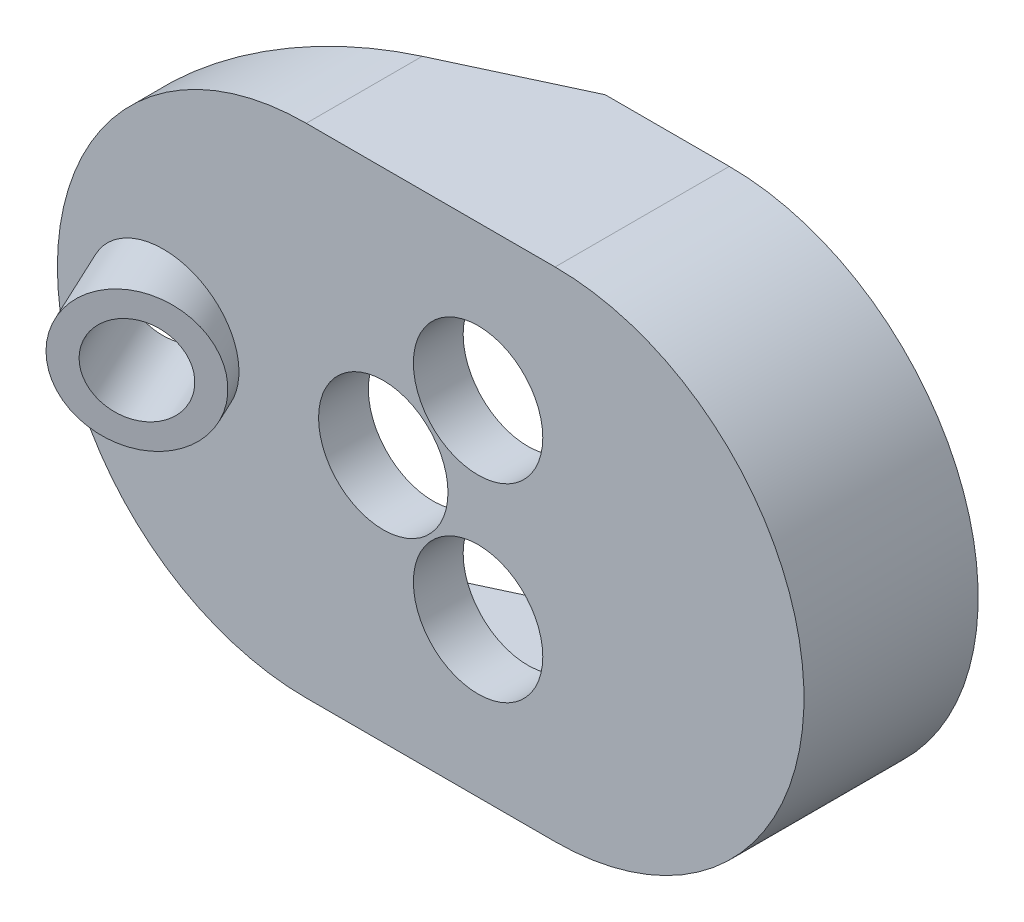
ISO-10303-21;
HEADER;
FILE_DESCRIPTION(('STEP AP214'),'2;1');
FILE_NAME('part.step','',(''),(''),'','','');
FILE_SCHEMA(('AUTOMOTIVE_DESIGN { 1 0 10303 214 1 1 1 1 }'));
ENDSEC;
DATA;
#1=APPLICATION_CONTEXT('core data for automotive mechanical design processes');
#2=APPLICATION_PROTOCOL_DEFINITION('international standard','automotive_design',2000,#1);
#3=PRODUCT_CONTEXT('',#1,'mechanical');
#4=PRODUCT('Part','Part','',(#3));
#5=PRODUCT_RELATED_PRODUCT_CATEGORY('part','',(#4));
#6=PRODUCT_DEFINITION_FORMATION('','',#4);
#7=PRODUCT_DEFINITION_CONTEXT('part definition',#1,'design');
#8=PRODUCT_DEFINITION('design','',#6,#7);
#9=PRODUCT_DEFINITION_SHAPE('','',#8);
#10=(LENGTH_UNIT() NAMED_UNIT(*) SI_UNIT(.MILLI.,.METRE.));
#11=(NAMED_UNIT(*) PLANE_ANGLE_UNIT() SI_UNIT($,.RADIAN.));
#12=(NAMED_UNIT(*) SI_UNIT($,.STERADIAN.) SOLID_ANGLE_UNIT());
#13=UNCERTAINTY_MEASURE_WITH_UNIT(LENGTH_MEASURE(1.E-05),#10,'distance_accuracy_value','');
#14=(GEOMETRIC_REPRESENTATION_CONTEXT(3) GLOBAL_UNCERTAINTY_ASSIGNED_CONTEXT((#13)) GLOBAL_UNIT_ASSIGNED_CONTEXT((#10,
#11,#12)) REPRESENTATION_CONTEXT('',''));
#15=CARTESIAN_POINT('',(0.,0.,0.));
#16=DIRECTION('',(0.,0.,1.));
#17=DIRECTION('',(1.,0.,0.));
#18=AXIS2_PLACEMENT_3D('',#15,#16,#17);
#19=CARTESIAN_POINT('',(-5.,0.,0.));
#20=DIRECTION('',(0.,0.,1.));
#21=DIRECTION('',(1.,0.,0.));
#22=AXIS2_PLACEMENT_3D('',#19,#20,#21);
#23=PLANE('',#22);
#24=CARTESIAN_POINT('',(11.5,2.5,0.));
#25=DIRECTION('',(0.,0.,-1.));
#26=DIRECTION('',(-1.,0.,0.));
#27=AXIS2_PLACEMENT_3D('',#24,#25,#26);
#28=CIRCLE('',#27,2.);
#29=CARTESIAN_POINT('',(9.5,2.5,0.));
#30=VERTEX_POINT('',#29);
#31=EDGE_CURVE('E258',#30,#30,#28,.T.);
#32=ORIENTED_EDGE('',*,*,#31,.F.);
#33=EDGE_LOOP('',(#32));
#34=FACE_BOUND('',#33,.T.);
#35=CARTESIAN_POINT('',(11.5,-2.5,0.));
#36=DIRECTION('',(0.,0.,-1.));
#37=DIRECTION('',(-1.,0.,0.));
#38=AXIS2_PLACEMENT_3D('',#35,#36,#37);
#39=CIRCLE('',#38,2.);
#40=CARTESIAN_POINT('',(9.5,-2.5,0.));
#41=VERTEX_POINT('',#40);
#42=EDGE_CURVE('E268',#41,#41,#39,.T.);
#43=ORIENTED_EDGE('',*,*,#42,.F.);
#44=EDGE_LOOP('',(#43));
#45=FACE_BOUND('',#44,.T.);
#46=DIRECTION('',(0.,-1.,0.));
#47=VECTOR('',#46,1.);
#48=CARTESIAN_POINT('',(0.0115484435668667,10.,0.));
#49=LINE('',#48,#47);
#50=CARTESIAN_POINT('',(0.0115484435668667,10.,0.));
#51=VERTEX_POINT('',#50);
#52=CARTESIAN_POINT('',(0.0115484435668708,8.,0.));
#53=VERTEX_POINT('',#52);
#54=EDGE_CURVE('E64',#51,#53,#49,.T.);
#55=ORIENTED_EDGE('',*,*,#54,.F.);
#56=DIRECTION('',(-1.,0.,0.));
#57=VECTOR('',#56,1.);
#58=CARTESIAN_POINT('',(-5.,10.,0.));
#59=LINE('',#58,#57);
#60=CARTESIAN_POINT('',(5.,10.,0.));
#61=VERTEX_POINT('',#60);
#62=EDGE_CURVE('E152',#61,#51,#59,.T.);
#63=ORIENTED_EDGE('',*,*,#62,.F.);
#64=CARTESIAN_POINT('',(5.,0.,0.));
#65=DIRECTION('',(0.,0.,1.));
#66=DIRECTION('',(1.,0.,0.));
#67=AXIS2_PLACEMENT_3D('',#64,#65,#66);
#68=CIRCLE('',#67,10.);
#69=CARTESIAN_POINT('',(5.,-10.,0.));
#70=VERTEX_POINT('',#69);
#71=EDGE_CURVE('E89',#70,#61,#68,.T.);
#72=ORIENTED_EDGE('',*,*,#71,.F.);
#73=DIRECTION('',(1.,0.,0.));
#74=VECTOR('',#73,1.);
#75=CARTESIAN_POINT('',(-5.,-10.,0.));
#76=LINE('',#75,#74);
#77=CARTESIAN_POINT('',(0.0115484435668702,-10.,0.));
#78=VERTEX_POINT('',#77);
#79=EDGE_CURVE('E166',#78,#70,#76,.T.);
#80=ORIENTED_EDGE('',*,*,#79,.F.);
#81=CARTESIAN_POINT('',(0.0115484435668698,-8.,0.));
#82=VERTEX_POINT('',#81);
#83=EDGE_CURVE('E146',#82,#78,#49,.T.);
#84=ORIENTED_EDGE('',*,*,#83,.F.);
#85=DIRECTION('',(-1.,0.,0.));
#86=VECTOR('',#85,1.);
#87=CARTESIAN_POINT('',(8.,-8.,0.));
#88=LINE('',#87,#86);
#89=CARTESIAN_POINT('',(8.,-8.,0.));
#90=VERTEX_POINT('',#89);
#91=EDGE_CURVE('E203',#90,#82,#88,.T.);
#92=ORIENTED_EDGE('',*,*,#91,.F.);
#93=DIRECTION('',(0.,-1.,0.));
#94=VECTOR('',#93,1.);
#95=CARTESIAN_POINT('',(8.,8.,0.));
#96=LINE('',#95,#94);
#97=CARTESIAN_POINT('',(8.,8.,0.));
#98=VERTEX_POINT('',#97);
#99=EDGE_CURVE('E291',#98,#90,#96,.T.);
#100=ORIENTED_EDGE('',*,*,#99,.F.);
#101=DIRECTION('',(1.,0.,0.));
#102=VECTOR('',#101,1.);
#103=CARTESIAN_POINT('',(8.,8.,0.));
#104=LINE('',#103,#102);
#105=EDGE_CURVE('E154',#53,#98,#104,.T.);
#106=ORIENTED_EDGE('',*,*,#105,.F.);
#107=EDGE_LOOP('',(#55,#63,#72,#80,#84,#92,#100,#106));
#108=FACE_BOUND('',#107,.T.);
#109=ADVANCED_FACE('F47',(#34,#45,#108),#23,.F.);
#110=CARTESIAN_POINT('',(-5.,0.,7.));
#111=DIRECTION('',(0.,0.,-1.));
#112=DIRECTION('',(-1.,0.,0.));
#113=AXIS2_PLACEMENT_3D('',#110,#111,#112);
#114=CYLINDRICAL_SURFACE('',#113,10.);
#115=CARTESIAN_POINT('',(-5.,0.,2.33692341845));
#116=DIRECTION('',(-0.4226182617407,0.,-0.906307787036649));
#117=DIRECTION('',(0.906307787036649,0.,-0.4226182617407));
#118=AXIS2_PLACEMENT_3D('',#115,#116,#117);
#119=ELLIPSE('',#118,11.0337791896249,10.);
#120=CARTESIAN_POINT('',(-5.,-10.,2.33692341845));
#121=VERTEX_POINT('',#120);
#122=CARTESIAN_POINT('',(-15.,0.,7.));
#123=VERTEX_POINT('',#122);
#124=EDGE_CURVE('E251',#121,#123,#119,.T.);
#125=ORIENTED_EDGE('',*,*,#124,.F.);
#126=DIRECTION('',(0.,0.,-1.));
#127=VECTOR('',#126,1.);
#128=CARTESIAN_POINT('',(-5.,-10.,7.));
#129=LINE('',#128,#127);
#130=CARTESIAN_POINT('',(-5.,-10.,7.));
#131=VERTEX_POINT('',#130);
#132=EDGE_CURVE('E178',#131,#121,#129,.T.);
#133=ORIENTED_EDGE('',*,*,#132,.F.);
#134=CARTESIAN_POINT('',(-5.,0.,7.));
#135=DIRECTION('',(0.,0.,1.));
#136=DIRECTION('',(1.,0.,0.));
#137=AXIS2_PLACEMENT_3D('',#134,#135,#136);
#138=CIRCLE('',#137,10.);
#139=EDGE_CURVE('E95',#123,#131,#138,.T.);
#140=ORIENTED_EDGE('',*,*,#139,.F.);
#141=EDGE_LOOP('',(#125,#133,#140));
#142=FACE_BOUND('',#141,.T.);
#143=ADVANCED_FACE('F49',(#142),#114,.T.);
#144=CARTESIAN_POINT('',(-5.,10.,2.33692341845));
#145=VERTEX_POINT('',#144);
#146=EDGE_CURVE('E141',#123,#145,#119,.T.);
#147=ORIENTED_EDGE('',*,*,#146,.F.);
#148=CARTESIAN_POINT('',(-5.,10.,7.));
#149=VERTEX_POINT('',#148);
#150=EDGE_CURVE('E164',#149,#123,#138,.T.);
#151=ORIENTED_EDGE('',*,*,#150,.F.);
#152=DIRECTION('',(0.,0.,-1.));
#153=VECTOR('',#152,1.);
#154=CARTESIAN_POINT('',(-5.,10.,7.));
#155=LINE('',#154,#153);
#156=EDGE_CURVE('E170',#149,#145,#155,.T.);
#157=ORIENTED_EDGE('',*,*,#156,.T.);
#158=EDGE_LOOP('',(#147,#151,#157));
#159=FACE_BOUND('',#158,.T.);
#160=ADVANCED_FACE('F334',(#159),#114,.T.);
#161=CARTESIAN_POINT('',(-5.,-10.,7.));
#162=DIRECTION('',(0.,1.,0.));
#163=DIRECTION('',(-1.,0.,0.));
#164=AXIS2_PLACEMENT_3D('',#161,#162,#163);
#165=PLANE('',#164);
#166=DIRECTION('',(0.906307787036649,0.,-0.4226182617407));
#167=VECTOR('',#166,1.);
#168=CARTESIAN_POINT('',(0.0020626235654621,-10.,0.00442331051053647));
#169=LINE('',#168,#167);
#170=EDGE_CURVE('E147',#121,#78,#169,.T.);
#171=ORIENTED_EDGE('',*,*,#170,.T.);
#172=ORIENTED_EDGE('',*,*,#79,.T.);
#173=DIRECTION('',(0.,0.,-1.));
#174=VECTOR('',#173,1.);
#175=CARTESIAN_POINT('',(5.,-10.,7.));
#176=LINE('',#175,#174);
#177=CARTESIAN_POINT('',(5.,-10.,7.));
#178=VERTEX_POINT('',#177);
#179=EDGE_CURVE('E175',#178,#70,#176,.T.);
#180=ORIENTED_EDGE('',*,*,#179,.F.);
#181=DIRECTION('',(1.,0.,0.));
#182=VECTOR('',#181,1.);
#183=CARTESIAN_POINT('',(-5.,-10.,7.));
#184=LINE('',#183,#182);
#185=EDGE_CURVE('E230',#131,#178,#184,.T.);
#186=ORIENTED_EDGE('',*,*,#185,.F.);
#187=ORIENTED_EDGE('',*,*,#132,.T.);
#188=EDGE_LOOP('',(#171,#172,#180,#186,#187));
#189=FACE_BOUND('',#188,.T.);
#190=ADVANCED_FACE('F242',(#189),#165,.F.);
#191=CARTESIAN_POINT('',(-5.,10.,7.));
#192=DIRECTION('',(0.,-1.,0.));
#193=DIRECTION('',(1.,0.,0.));
#194=AXIS2_PLACEMENT_3D('',#191,#192,#193);
#195=PLANE('',#194);
#196=DIRECTION('',(0.906307787036649,0.,-0.4226182617407));
#197=VECTOR('',#196,1.);
#198=CARTESIAN_POINT('',(0.00206262356545863,10.,0.00442331051053647));
#199=LINE('',#198,#197);
#200=EDGE_CURVE('E137',#145,#51,#199,.T.);
#201=ORIENTED_EDGE('',*,*,#200,.F.);
#202=ORIENTED_EDGE('',*,*,#156,.F.);
#203=DIRECTION('',(-1.,0.,0.));
#204=VECTOR('',#203,1.);
#205=CARTESIAN_POINT('',(-5.,10.,7.));
#206=LINE('',#205,#204);
#207=CARTESIAN_POINT('',(5.,10.,7.));
#208=VERTEX_POINT('',#207);
#209=EDGE_CURVE('E73',#208,#149,#206,.T.);
#210=ORIENTED_EDGE('',*,*,#209,.F.);
#211=DIRECTION('',(0.,0.,-1.));
#212=VECTOR('',#211,1.);
#213=CARTESIAN_POINT('',(5.,10.,7.));
#214=LINE('',#213,#212);
#215=EDGE_CURVE('E159',#208,#61,#214,.T.);
#216=ORIENTED_EDGE('',*,*,#215,.T.);
#217=ORIENTED_EDGE('',*,*,#62,.T.);
#218=EDGE_LOOP('',(#201,#202,#210,#216,#217));
#219=FACE_BOUND('',#218,.T.);
#220=ADVANCED_FACE('F158',(#219),#195,.F.);
#221=CARTESIAN_POINT('',(-8.,8.,5.));
#222=DIRECTION('',(-1.,0.,0.));
#223=DIRECTION('',(0.,-1.,0.));
#224=AXIS2_PLACEMENT_3D('',#221,#222,#223);
#225=PLANE('',#224);
#226=DIRECTION('',(0.,-1.,0.));
#227=VECTOR('',#226,1.);
#228=CARTESIAN_POINT('',(-8.,8.,3.735846392915));
#229=LINE('',#228,#227);
#230=CARTESIAN_POINT('',(-8.,8.,3.735846392915));
#231=VERTEX_POINT('',#230);
#232=CARTESIAN_POINT('',(-8.00000000000001,-8.,3.735846392915));
#233=VERTEX_POINT('',#232);
#234=EDGE_CURVE('E156',#231,#233,#229,.T.);
#235=ORIENTED_EDGE('',*,*,#234,.F.);
#236=DIRECTION('',(0.,0.,-1.));
#237=VECTOR('',#236,1.);
#238=CARTESIAN_POINT('',(-8.,8.,5.));
#239=LINE('',#238,#237);
#240=CARTESIAN_POINT('',(-8.,8.,5.));
#241=VERTEX_POINT('',#240);
#242=EDGE_CURVE('E209',#241,#231,#239,.T.);
#243=ORIENTED_EDGE('',*,*,#242,.F.);
#244=DIRECTION('',(0.,1.,0.));
#245=VECTOR('',#244,1.);
#246=CARTESIAN_POINT('',(-8.,8.,5.));
#247=LINE('',#246,#245);
#248=CARTESIAN_POINT('',(-8.00000000000001,-8.,5.));
#249=VERTEX_POINT('',#248);
#250=EDGE_CURVE('E275',#249,#241,#247,.T.);
#251=ORIENTED_EDGE('',*,*,#250,.F.);
#252=DIRECTION('',(0.,0.,-1.));
#253=VECTOR('',#252,1.);
#254=CARTESIAN_POINT('',(-8.00000000000001,-8.,5.));
#255=LINE('',#254,#253);
#256=EDGE_CURVE('E185',#249,#233,#255,.T.);
#257=ORIENTED_EDGE('',*,*,#256,.T.);
#258=EDGE_LOOP('',(#235,#243,#251,#257));
#259=FACE_BOUND('',#258,.T.);
#260=ADVANCED_FACE('F306',(#259),#225,.F.);
#261=CARTESIAN_POINT('',(8.,-8.,5.));
#262=DIRECTION('',(0.,-1.,0.));
#263=DIRECTION('',(0.,0.,-1.));
#264=AXIS2_PLACEMENT_3D('',#261,#262,#263);
#265=PLANE('',#264);
#266=DIRECTION('',(0.906307787036649,0.,-0.4226182617407));
#267=VECTOR('',#266,1.);
#268=CARTESIAN_POINT('',(4.65810195451416,-8.,-2.16672348618172));
#269=LINE('',#268,#267);
#270=EDGE_CURVE('E260',#233,#82,#269,.T.);
#271=ORIENTED_EDGE('',*,*,#270,.F.);
#272=ORIENTED_EDGE('',*,*,#256,.F.);
#273=DIRECTION('',(-1.,0.,0.));
#274=VECTOR('',#273,1.);
#275=CARTESIAN_POINT('',(8.,-8.,5.));
#276=LINE('',#275,#274);
#277=CARTESIAN_POINT('',(8.,-8.,5.));
#278=VERTEX_POINT('',#277);
#279=EDGE_CURVE('E212',#278,#249,#276,.T.);
#280=ORIENTED_EDGE('',*,*,#279,.F.);
#281=DIRECTION('',(0.,0.,-1.));
#282=VECTOR('',#281,1.);
#283=CARTESIAN_POINT('',(8.,-8.,5.));
#284=LINE('',#283,#282);
#285=EDGE_CURVE('E194',#278,#90,#284,.T.);
#286=ORIENTED_EDGE('',*,*,#285,.T.);
#287=ORIENTED_EDGE('',*,*,#91,.T.);
#288=EDGE_LOOP('',(#271,#272,#280,#286,#287));
#289=FACE_BOUND('',#288,.T.);
#290=ADVANCED_FACE('F300',(#289),#265,.F.);
#291=CARTESIAN_POINT('',(8.,8.,5.));
#292=DIRECTION('',(0.,1.,0.));
#293=DIRECTION('',(0.,0.,1.));
#294=AXIS2_PLACEMENT_3D('',#291,#292,#293);
#295=PLANE('',#294);
#296=DIRECTION('',(-0.906307787036649,0.,0.4226182617407));
#297=VECTOR('',#296,1.);
#298=CARTESIAN_POINT('',(4.65810195451416,8.,-2.16672348618173));
#299=LINE('',#298,#297);
#300=EDGE_CURVE('E51',#53,#231,#299,.T.);
#301=ORIENTED_EDGE('',*,*,#300,.F.);
#302=ORIENTED_EDGE('',*,*,#105,.T.);
#303=DIRECTION('',(0.,0.,-1.));
#304=VECTOR('',#303,1.);
#305=CARTESIAN_POINT('',(8.,8.,5.));
#306=LINE('',#305,#304);
#307=CARTESIAN_POINT('',(8.,8.,5.));
#308=VERTEX_POINT('',#307);
#309=EDGE_CURVE('E200',#308,#98,#306,.T.);
#310=ORIENTED_EDGE('',*,*,#309,.F.);
#311=DIRECTION('',(1.,0.,0.));
#312=VECTOR('',#311,1.);
#313=CARTESIAN_POINT('',(8.,8.,5.));
#314=LINE('',#313,#312);
#315=EDGE_CURVE('E279',#241,#308,#314,.T.);
#316=ORIENTED_EDGE('',*,*,#315,.F.);
#317=ORIENTED_EDGE('',*,*,#242,.T.);
#318=EDGE_LOOP('',(#301,#302,#310,#316,#317));
#319=FACE_BOUND('',#318,.T.);
#320=ADVANCED_FACE('F309',(#319),#295,.F.);
#321=CARTESIAN_POINT('',(1.90500000000001,3.81,7.));
#322=DIRECTION('',(0.,0.,-1.));
#323=DIRECTION('',(-1.,0.,0.));
#324=AXIS2_PLACEMENT_3D('',#321,#322,#323);
#325=CYLINDRICAL_SURFACE('',#324,2.6);
#326=CARTESIAN_POINT('',(1.90500000000001,3.81,7.));
#327=DIRECTION('',(0.,0.,1.));
#328=DIRECTION('',(1.,0.,0.));
#329=AXIS2_PLACEMENT_3D('',#326,#327,#328);
#330=CIRCLE('',#329,2.6);
#331=CARTESIAN_POINT('',(4.50500000000001,3.81,7.));
#332=VERTEX_POINT('',#331);
#333=EDGE_CURVE('E225',#332,#332,#330,.T.);
#334=ORIENTED_EDGE('',*,*,#333,.T.);
#335=EDGE_LOOP('',(#334));
#336=FACE_BOUND('',#335,.T.);
#337=CARTESIAN_POINT('',(1.90500000000001,3.81,5.));
#338=DIRECTION('',(0.,0.,-1.));
#339=DIRECTION('',(-1.,0.,0.));
#340=AXIS2_PLACEMENT_3D('',#337,#338,#339);
#341=CIRCLE('',#340,2.6);
#342=CARTESIAN_POINT('',(-0.694999999999991,3.81,5.));
#343=VERTEX_POINT('',#342);
#344=EDGE_CURVE('E191',#343,#343,#341,.T.);
#345=ORIENTED_EDGE('',*,*,#344,.T.);
#346=EDGE_LOOP('',(#345));
#347=FACE_BOUND('',#346,.T.);
#348=ADVANCED_FACE('F419',(#336,#347),#325,.F.);
#349=CARTESIAN_POINT('',(1.90500000000001,-3.81,7.));
#350=DIRECTION('',(0.,0.,-1.));
#351=DIRECTION('',(-1.,0.,0.));
#352=AXIS2_PLACEMENT_3D('',#349,#350,#351);
#353=CYLINDRICAL_SURFACE('',#352,2.6);
#354=CARTESIAN_POINT('',(1.90500000000001,-3.81,7.));
#355=DIRECTION('',(0.,0.,1.));
#356=DIRECTION('',(1.,0.,0.));
#357=AXIS2_PLACEMENT_3D('',#354,#355,#356);
#358=CIRCLE('',#357,2.6);
#359=CARTESIAN_POINT('',(4.50500000000001,-3.81,7.));
#360=VERTEX_POINT('',#359);
#361=EDGE_CURVE('E221',#360,#360,#358,.T.);
#362=ORIENTED_EDGE('',*,*,#361,.T.);
#363=EDGE_LOOP('',(#362));
#364=FACE_BOUND('',#363,.T.);
#365=CARTESIAN_POINT('',(1.90500000000001,-3.81,5.));
#366=DIRECTION('',(0.,0.,-1.));
#367=DIRECTION('',(-1.,0.,0.));
#368=AXIS2_PLACEMENT_3D('',#365,#366,#367);
#369=CIRCLE('',#368,2.6);
#370=CARTESIAN_POINT('',(-0.694999999999994,-3.81,5.));
#371=VERTEX_POINT('',#370);
#372=EDGE_CURVE('E184',#371,#371,#369,.T.);
#373=ORIENTED_EDGE('',*,*,#372,.T.);
#374=EDGE_LOOP('',(#373));
#375=FACE_BOUND('',#374,.T.);
#376=ADVANCED_FACE('F500',(#364,#375),#353,.F.);
#377=CARTESIAN_POINT('',(-1.90500000000001,0.,7.));
#378=DIRECTION('',(0.,0.,-1.));
#379=DIRECTION('',(-1.,0.,0.));
#380=AXIS2_PLACEMENT_3D('',#377,#378,#379);
#381=CYLINDRICAL_SURFACE('',#380,2.6);
#382=CARTESIAN_POINT('',(-1.90500000000001,0.,7.));
#383=DIRECTION('',(0.,0.,1.));
#384=DIRECTION('',(1.,0.,0.));
#385=AXIS2_PLACEMENT_3D('',#382,#383,#384);
#386=CIRCLE('',#385,2.6);
#387=CARTESIAN_POINT('',(0.694999999999992,0.,7.));
#388=VERTEX_POINT('',#387);
#389=EDGE_CURVE('E217',#388,#388,#386,.T.);
#390=ORIENTED_EDGE('',*,*,#389,.T.);
#391=EDGE_LOOP('',(#390));
#392=FACE_BOUND('',#391,.T.);
#393=CARTESIAN_POINT('',(-1.90500000000001,0.,5.));
#394=DIRECTION('',(0.,0.,-1.));
#395=DIRECTION('',(-1.,0.,0.));
#396=AXIS2_PLACEMENT_3D('',#393,#394,#395);
#397=CIRCLE('',#396,2.6);
#398=CARTESIAN_POINT('',(-4.50500000000001,0.,5.));
#399=VERTEX_POINT('',#398);
#400=EDGE_CURVE('E181',#399,#399,#397,.T.);
#401=ORIENTED_EDGE('',*,*,#400,.T.);
#402=EDGE_LOOP('',(#401));
#403=FACE_BOUND('',#402,.T.);
#404=ADVANCED_FACE('F410',(#392,#403),#381,.F.);
#405=CARTESIAN_POINT('',(-5.,0.,7.));
#406=DIRECTION('',(0.,0.,1.));
#407=DIRECTION('',(1.,0.,0.));
#408=AXIS2_PLACEMENT_3D('',#405,#406,#407);
#409=PLANE('',#408);
#410=CARTESIAN_POINT('',(-10.738950087811,0.,7.));
#411=DIRECTION('',(0.,0.,1.));
#412=DIRECTION('',(-1.,0.,0.));
#413=AXIS2_PLACEMENT_3D('',#410,#411,#412);
#414=ELLIPSE('',#413,3.03428927714685,2.75);
#415=CARTESIAN_POINT('',(-13.7732393649579,0.,7.));
#416=VERTEX_POINT('',#415);
#417=EDGE_CURVE('E12',#416,#416,#414,.T.);
#418=ORIENTED_EDGE('',*,*,#417,.F.);
#419=EDGE_LOOP('',(#418));
#420=FACE_BOUND('',#419,.T.);
#421=ORIENTED_EDGE('',*,*,#361,.F.);
#422=EDGE_LOOP('',(#421));
#423=FACE_BOUND('',#422,.T.);
#424=ORIENTED_EDGE('',*,*,#150,.T.);
#425=ORIENTED_EDGE('',*,*,#139,.T.);
#426=ORIENTED_EDGE('',*,*,#185,.T.);
#427=CARTESIAN_POINT('',(5.,0.,7.));
#428=DIRECTION('',(0.,0.,1.));
#429=DIRECTION('',(1.,0.,0.));
#430=AXIS2_PLACEMENT_3D('',#427,#428,#429);
#431=CIRCLE('',#430,10.);
#432=EDGE_CURVE('E233',#178,#208,#431,.T.);
#433=ORIENTED_EDGE('',*,*,#432,.T.);
#434=ORIENTED_EDGE('',*,*,#209,.T.);
#435=EDGE_LOOP('',(#424,#425,#426,#433,#434));
#436=FACE_BOUND('',#435,.T.);
#437=ORIENTED_EDGE('',*,*,#333,.F.);
#438=EDGE_LOOP('',(#437));
#439=FACE_BOUND('',#438,.T.);
#440=ORIENTED_EDGE('',*,*,#389,.F.);
#441=EDGE_LOOP('',(#440));
#442=FACE_BOUND('',#441,.T.);
#443=ADVANCED_FACE('F246',(#420,#423,#436,#439,#442),#409,.T.);
#444=CARTESIAN_POINT('',(5.,0.,7.));
#445=DIRECTION('',(0.,0.,-1.));
#446=DIRECTION('',(-1.,0.,0.));
#447=AXIS2_PLACEMENT_3D('',#444,#445,#446);
#448=CYLINDRICAL_SURFACE('',#447,10.);
#449=ORIENTED_EDGE('',*,*,#71,.T.);
#450=ORIENTED_EDGE('',*,*,#215,.F.);
#451=ORIENTED_EDGE('',*,*,#432,.F.);
#452=ORIENTED_EDGE('',*,*,#179,.T.);
#453=EDGE_LOOP('',(#449,#450,#451,#452));
#454=FACE_BOUND('',#453,.T.);
#455=ADVANCED_FACE('F245',(#454),#448,.T.);
#456=CARTESIAN_POINT('',(8.,8.,5.));
#457=DIRECTION('',(1.,0.,0.));
#458=DIRECTION('',(0.,1.,0.));
#459=AXIS2_PLACEMENT_3D('',#456,#457,#458);
#460=PLANE('',#459);
#461=ORIENTED_EDGE('',*,*,#99,.T.);
#462=ORIENTED_EDGE('',*,*,#285,.F.);
#463=DIRECTION('',(0.,-1.,0.));
#464=VECTOR('',#463,1.);
#465=CARTESIAN_POINT('',(8.,8.,5.));
#466=LINE('',#465,#464);
#467=EDGE_CURVE('E283',#308,#278,#466,.T.);
#468=ORIENTED_EDGE('',*,*,#467,.F.);
#469=ORIENTED_EDGE('',*,*,#309,.T.);
#470=EDGE_LOOP('',(#461,#462,#468,#469));
#471=FACE_BOUND('',#470,.T.);
#472=ADVANCED_FACE('F313',(#471),#460,.F.);
#473=CARTESIAN_POINT('',(0.,0.,5.));
#474=DIRECTION('',(0.,0.,-1.));
#475=DIRECTION('',(-1.,0.,0.));
#476=AXIS2_PLACEMENT_3D('',#473,#474,#475);
#477=PLANE('',#476);
#478=ORIENTED_EDGE('',*,*,#344,.F.);
#479=EDGE_LOOP('',(#478));
#480=FACE_BOUND('',#479,.T.);
#481=ORIENTED_EDGE('',*,*,#372,.F.);
#482=EDGE_LOOP('',(#481));
#483=FACE_BOUND('',#482,.T.);
#484=ORIENTED_EDGE('',*,*,#400,.F.);
#485=EDGE_LOOP('',(#484));
#486=FACE_BOUND('',#485,.T.);
#487=ORIENTED_EDGE('',*,*,#250,.T.);
#488=ORIENTED_EDGE('',*,*,#315,.T.);
#489=ORIENTED_EDGE('',*,*,#467,.T.);
#490=ORIENTED_EDGE('',*,*,#279,.T.);
#491=EDGE_LOOP('',(#487,#488,#489,#490));
#492=FACE_BOUND('',#491,.T.);
#493=ADVANCED_FACE('F312',(#480,#483,#486,#492),#477,.T.);
#494=CARTESIAN_POINT('',(11.5,2.5,4.));
#495=DIRECTION('',(0.,0.,-1.));
#496=DIRECTION('',(-1.,0.,0.));
#497=AXIS2_PLACEMENT_3D('',#494,#495,#496);
#498=CYLINDRICAL_SURFACE('',#497,2.);
#499=CARTESIAN_POINT('',(11.5,2.5,4.));
#500=DIRECTION('',(0.,0.,-1.));
#501=DIRECTION('',(-1.,0.,0.));
#502=AXIS2_PLACEMENT_3D('',#499,#500,#501);
#503=CIRCLE('',#502,2.);
#504=CARTESIAN_POINT('',(9.5,2.5,4.));
#505=VERTEX_POINT('',#504);
#506=EDGE_CURVE('E253',#505,#505,#503,.T.);
#507=ORIENTED_EDGE('',*,*,#506,.F.);
#508=EDGE_LOOP('',(#507));
#509=FACE_BOUND('',#508,.T.);
#510=ORIENTED_EDGE('',*,*,#31,.T.);
#511=EDGE_LOOP('',(#510));
#512=FACE_BOUND('',#511,.T.);
#513=ADVANCED_FACE('F320',(#509,#512),#498,.F.);
#514=CARTESIAN_POINT('',(11.5,2.5,4.));
#515=DIRECTION('',(0.,0.,-1.));
#516=DIRECTION('',(-1.,0.,0.));
#517=AXIS2_PLACEMENT_3D('',#514,#515,#516);
#518=PLANE('',#517);
#519=ORIENTED_EDGE('',*,*,#506,.T.);
#520=EDGE_LOOP('',(#519));
#521=FACE_BOUND('',#520,.T.);
#522=ADVANCED_FACE('F462',(#521),#518,.T.);
#523=CARTESIAN_POINT('',(11.5,-2.5,4.));
#524=DIRECTION('',(0.,0.,-1.));
#525=DIRECTION('',(-1.,0.,0.));
#526=AXIS2_PLACEMENT_3D('',#523,#524,#525);
#527=CYLINDRICAL_SURFACE('',#526,2.);
#528=CARTESIAN_POINT('',(11.5,-2.5,4.));
#529=DIRECTION('',(0.,0.,-1.));
#530=DIRECTION('',(-1.,0.,0.));
#531=AXIS2_PLACEMENT_3D('',#528,#529,#530);
#532=CIRCLE('',#531,2.);
#533=CARTESIAN_POINT('',(9.5,-2.5,4.));
#534=VERTEX_POINT('',#533);
#535=EDGE_CURVE('E264',#534,#534,#532,.T.);
#536=ORIENTED_EDGE('',*,*,#535,.F.);
#537=EDGE_LOOP('',(#536));
#538=FACE_BOUND('',#537,.T.);
#539=ORIENTED_EDGE('',*,*,#42,.T.);
#540=EDGE_LOOP('',(#539));
#541=FACE_BOUND('',#540,.T.);
#542=ADVANCED_FACE('F452',(#538,#541),#527,.F.);
#543=CARTESIAN_POINT('',(11.5,-2.5,4.));
#544=DIRECTION('',(0.,0.,-1.));
#545=DIRECTION('',(-1.,0.,0.));
#546=AXIS2_PLACEMENT_3D('',#543,#544,#545);
#547=PLANE('',#546);
#548=ORIENTED_EDGE('',*,*,#535,.T.);
#549=EDGE_LOOP('',(#548));
#550=FACE_BOUND('',#549,.T.);
#551=ADVANCED_FACE('F370',(#550),#547,.T.);
#552=CARTESIAN_POINT('',(0.00206262356545863,10.,0.00442331051053647));
#553=DIRECTION('',(-0.4226182617407,0.,-0.906307787036649));
#554=DIRECTION('',(-0.906307787036649,0.,0.4226182617407));
#555=AXIS2_PLACEMENT_3D('',#552,#553,#554);
#556=PLANE('',#555);
#557=ORIENTED_EDGE('',*,*,#124,.T.);
#558=ORIENTED_EDGE('',*,*,#146,.T.);
#559=ORIENTED_EDGE('',*,*,#200,.T.);
#560=ORIENTED_EDGE('',*,*,#54,.T.);
#561=ORIENTED_EDGE('',*,*,#300,.T.);
#562=ORIENTED_EDGE('',*,*,#234,.T.);
#563=ORIENTED_EDGE('',*,*,#270,.T.);
#564=ORIENTED_EDGE('',*,*,#83,.T.);
#565=ORIENTED_EDGE('',*,*,#170,.F.);
#566=EDGE_LOOP('',(#557,#558,#559,#560,#561,#562,#563,#564,#565));
#567=FACE_BOUND('',#566,.T.);
#568=CARTESIAN_POINT('',(-11.5,0.,5.3679231964575));
#569=DIRECTION('',(-0.4226182617407,0.,-0.906307787036649));
#570=DIRECTION('',(-0.90630778703665,0.,0.4226182617407));
#571=AXIS2_PLACEMENT_3D('',#568,#569,#570);
#572=CIRCLE('',#571,1.75);
#573=CARTESIAN_POINT('',(-13.0860386273141,0.,6.10750515450373));
#574=VERTEX_POINT('',#573);
#575=EDGE_CURVE('E549',#574,#574,#572,.T.);
#576=ORIENTED_EDGE('',*,*,#575,.F.);
#577=EDGE_LOOP('',(#576));
#578=FACE_BOUND('',#577,.T.);
#579=ADVANCED_FACE('F138',(#567,#578),#556,.T.);
#580=CARTESIAN_POINT('',(-6.14181414529807,0.,16.8585898432422));
#581=DIRECTION('',(-0.4226182617407,0.,-0.90630778703665));
#582=DIRECTION('',(-0.90630778703665,0.,0.4226182617407));
#583=AXIS2_PLACEMENT_3D('',#580,#581,#582);
#584=CYLINDRICAL_SURFACE('',#583,1.75);
#585=ORIENTED_EDGE('',*,*,#575,.T.);
#586=EDGE_LOOP('',(#585));
#587=FACE_BOUND('',#586,.T.);
#588=CARTESIAN_POINT('',(-9.8095269530372,0.,8.9931543446041));
#589=DIRECTION('',(-0.4226182617407,0.,-0.906307787036649));
#590=DIRECTION('',(-0.90630778703665,0.,0.4226182617407));
#591=AXIS2_PLACEMENT_3D('',#588,#589,#590);
#592=CIRCLE('',#591,1.75);
#593=CARTESIAN_POINT('',(-11.3955655803513,0.,9.73273630265032));
#594=VERTEX_POINT('',#593);
#595=EDGE_CURVE('E550',#594,#594,#592,.T.);
#596=ORIENTED_EDGE('',*,*,#595,.F.);
#597=EDGE_LOOP('',(#596));
#598=FACE_BOUND('',#597,.T.);
#599=ADVANCED_FACE('F369',(#587,#598),#584,.F.);
#600=CARTESIAN_POINT('',(-9.8095269530372,0.,8.9931543446041));
#601=DIRECTION('',(-0.4226182617407,0.,-0.90630778703665));
#602=DIRECTION('',(-0.906307787036649,0.,0.4226182617407));
#603=AXIS2_PLACEMENT_3D('',#600,#601,#602);
#604=CYLINDRICAL_SURFACE('',#603,2.75);
#605=ORIENTED_EDGE('',*,*,#417,.T.);
#606=EDGE_LOOP('',(#605));
#607=FACE_BOUND('',#606,.T.);
#608=CARTESIAN_POINT('',(-9.8095269530372,0.,8.9931543446041));
#609=DIRECTION('',(-0.4226182617407,0.,-0.906307787036649));
#610=DIRECTION('',(-0.90630778703665,0.,0.4226182617407));
#611=AXIS2_PLACEMENT_3D('',#608,#609,#610);
#612=CIRCLE('',#611,2.75);
#613=CARTESIAN_POINT('',(-12.301873367388,0.,10.155354564391));
#614=VERTEX_POINT('',#613);
#615=EDGE_CURVE('E546',#614,#614,#612,.T.);
#616=ORIENTED_EDGE('',*,*,#615,.T.);
#617=EDGE_LOOP('',(#616));
#618=FACE_BOUND('',#617,.T.);
#619=ADVANCED_FACE('F378',(#607,#618),#604,.T.);
#620=CARTESIAN_POINT('',(-9.8095269530372,0.,8.9931543446041));
#621=DIRECTION('',(-0.4226182617407,0.,-0.906307787036649));
#622=DIRECTION('',(-0.90630778703665,0.,0.4226182617407));
#623=AXIS2_PLACEMENT_3D('',#620,#621,#622);
#624=PLANE('',#623);
#625=ORIENTED_EDGE('',*,*,#595,.T.);
#626=EDGE_LOOP('',(#625));
#627=FACE_BOUND('',#626,.T.);
#628=ORIENTED_EDGE('',*,*,#615,.F.);
#629=EDGE_LOOP('',(#628));
#630=FACE_BOUND('',#629,.T.);
#631=ADVANCED_FACE('F388',(#627,#630),#624,.F.);
#632=CLOSED_SHELL('',(#109,#143,#160,#190,#220,#260,#290,#320,#348,#376,#404,#443,#455,#472,
#493,#513,#522,#542,#551,#579,#599,#619,#631));
#633=MANIFOLD_SOLID_BREP('B2',#632);
#634=ADVANCED_BREP_SHAPE_REPRESENTATION('',(#18,#633),#14);
#635=SHAPE_DEFINITION_REPRESENTATION(#9,#634);
ENDSEC;
END-ISO-10303-21;
